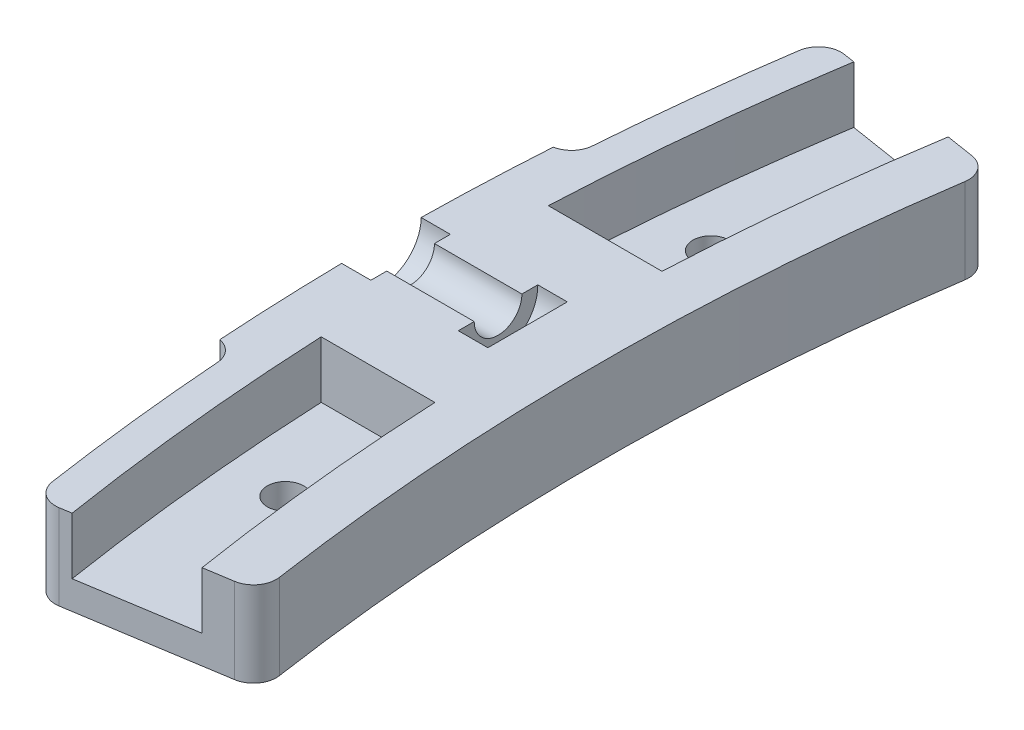
ISO-10303-21;
HEADER;
FILE_DESCRIPTION(('STEP AP214'),'2;1');
FILE_NAME('part.step','',(''),(''),'','','');
FILE_SCHEMA(('AUTOMOTIVE_DESIGN { 1 0 10303 214 1 1 1 1 }'));
ENDSEC;
DATA;
#1=APPLICATION_CONTEXT('core data for automotive mechanical design processes');
#2=APPLICATION_PROTOCOL_DEFINITION('international standard','automotive_design',2000,#1);
#3=PRODUCT_CONTEXT('',#1,'mechanical');
#4=PRODUCT('Part','Part','',(#3));
#5=PRODUCT_RELATED_PRODUCT_CATEGORY('part','',(#4));
#6=PRODUCT_DEFINITION_FORMATION('','',#4);
#7=PRODUCT_DEFINITION_CONTEXT('part definition',#1,'design');
#8=PRODUCT_DEFINITION('design','',#6,#7);
#9=PRODUCT_DEFINITION_SHAPE('','',#8);
#10=(LENGTH_UNIT() NAMED_UNIT(*) SI_UNIT(.MILLI.,.METRE.));
#11=(NAMED_UNIT(*) PLANE_ANGLE_UNIT() SI_UNIT($,.RADIAN.));
#12=(NAMED_UNIT(*) SI_UNIT($,.STERADIAN.) SOLID_ANGLE_UNIT());
#13=UNCERTAINTY_MEASURE_WITH_UNIT(LENGTH_MEASURE(1.E-05),#10,'distance_accuracy_value','');
#14=(GEOMETRIC_REPRESENTATION_CONTEXT(3) GLOBAL_UNCERTAINTY_ASSIGNED_CONTEXT((#13)) GLOBAL_UNIT_ASSIGNED_CONTEXT((#10,
#11,#12)) REPRESENTATION_CONTEXT('',''));
#15=CARTESIAN_POINT('',(0.,0.,0.));
#16=DIRECTION('',(0.,0.,1.));
#17=DIRECTION('',(1.,0.,0.));
#18=AXIS2_PLACEMENT_3D('',#15,#16,#17);
#19=CARTESIAN_POINT('',(0.,7.5,0.));
#20=DIRECTION('',(0.,1.,0.));
#21=DIRECTION('',(0.,0.,1.));
#22=AXIS2_PLACEMENT_3D('',#19,#20,#21);
#23=PLANE('',#22);
#24=CARTESIAN_POINT('',(0.,7.5,0.));
#25=DIRECTION('',(0.,1.,0.));
#26=DIRECTION('',(0.,0.,1.));
#27=AXIS2_PLACEMENT_3D('',#24,#25,#26);
#28=CIRCLE('',#27,224.5);
#29=CARTESIAN_POINT('',(-224.019328267066,7.5,-14.6830025121671));
#30=VERTEX_POINT('',#29);
#31=CARTESIAN_POINT('',(-224.472715491215,7.5,-3.5));
#32=VERTEX_POINT('',#31);
#33=EDGE_CURVE('E315',#30,#32,#28,.T.);
#34=ORIENTED_EDGE('',*,*,#33,.T.);
#35=DIRECTION('',(-1.,0.,0.));
#36=VECTOR('',#35,1.);
#37=CARTESIAN_POINT('',(-224.5,7.5,-3.5));
#38=LINE('',#37,#36);
#39=CARTESIAN_POINT('',(-221.9,7.5,-3.5));
#40=VERTEX_POINT('',#39);
#41=EDGE_CURVE('E220',#32,#40,#38,.F.);
#42=ORIENTED_EDGE('',*,*,#41,.T.);
#43=DIRECTION('',(0.,0.,1.));
#44=VECTOR('',#43,1.);
#45=CARTESIAN_POINT('',(-221.9,7.5,-3.21093044747705E-13));
#46=LINE('',#45,#44);
#47=CARTESIAN_POINT('',(-221.9,7.5,-2.10000000000001));
#48=VERTEX_POINT('',#47);
#49=EDGE_CURVE('E221',#40,#48,#46,.T.);
#50=ORIENTED_EDGE('',*,*,#49,.T.);
#51=DIRECTION('',(1.,0.,0.));
#52=VECTOR('',#51,1.);
#53=CARTESIAN_POINT('',(-224.5,7.5,-2.10000000000001));
#54=LINE('',#53,#52);
#55=CARTESIAN_POINT('',(-214.200000000001,7.5,-2.10000000000001));
#56=VERTEX_POINT('',#55);
#57=EDGE_CURVE('E242',#56,#48,#54,.F.);
#58=ORIENTED_EDGE('',*,*,#57,.F.);
#59=DIRECTION('',(0.,0.,1.));
#60=VECTOR('',#59,1.);
#61=CARTESIAN_POINT('',(-214.2,7.5,5.26399215997816E-12));
#62=LINE('',#61,#60);
#63=CARTESIAN_POINT('',(-214.200000000001,7.5,-3.49947186729268));
#64=VERTEX_POINT('',#63);
#65=EDGE_CURVE('E241',#64,#56,#62,.T.);
#66=ORIENTED_EDGE('',*,*,#65,.F.);
#67=DIRECTION('',(1.,0.,0.));
#68=VECTOR('',#67,1.);
#69=CARTESIAN_POINT('',(-214.200000000001,7.5,-3.49947186729268));
#70=LINE('',#69,#68);
#71=CARTESIAN_POINT('',(-211.600000000001,7.5,-3.49947186729274));
#72=VERTEX_POINT('',#71);
#73=EDGE_CURVE('E412',#64,#72,#70,.T.);
#74=ORIENTED_EDGE('',*,*,#73,.T.);
#75=DIRECTION('',(0.,0.,1.));
#76=VECTOR('',#75,1.);
#77=CARTESIAN_POINT('',(-211.6,7.5,5.20009683030522E-12));
#78=LINE('',#77,#76);
#79=CARTESIAN_POINT('',(-211.6,7.5,3.49947186730315));
#80=VERTEX_POINT('',#79);
#81=EDGE_CURVE('E404',#72,#80,#78,.T.);
#82=ORIENTED_EDGE('',*,*,#81,.T.);
#83=DIRECTION('',(1.,0.,0.));
#84=VECTOR('',#83,1.);
#85=CARTESIAN_POINT('',(-214.2,7.5,3.49947186730321));
#86=LINE('',#85,#84);
#87=CARTESIAN_POINT('',(-214.2,7.5,3.49947186730321));
#88=VERTEX_POINT('',#87);
#89=EDGE_CURVE('E409',#80,#88,#86,.F.);
#90=ORIENTED_EDGE('',*,*,#89,.T.);
#91=CARTESIAN_POINT('',(-214.2,7.5,2.09999999999999));
#92=VERTEX_POINT('',#91);
#93=EDGE_CURVE('E237',#92,#88,#62,.T.);
#94=ORIENTED_EDGE('',*,*,#93,.F.);
#95=DIRECTION('',(1.,0.,0.));
#96=VECTOR('',#95,1.);
#97=CARTESIAN_POINT('',(-224.5,7.5,2.09999999999999));
#98=LINE('',#97,#96);
#99=CARTESIAN_POINT('',(-221.9,7.5,2.09999999999999));
#100=VERTEX_POINT('',#99);
#101=EDGE_CURVE('E229',#100,#92,#98,.T.);
#102=ORIENTED_EDGE('',*,*,#101,.F.);
#103=CARTESIAN_POINT('',(-221.9,7.5,3.49999999999995));
#104=VERTEX_POINT('',#103);
#105=EDGE_CURVE('E56',#100,#104,#46,.T.);
#106=ORIENTED_EDGE('',*,*,#105,.T.);
#107=DIRECTION('',(-1.,0.,0.));
#108=VECTOR('',#107,1.);
#109=CARTESIAN_POINT('',(-224.5,7.5,3.49999999999995));
#110=LINE('',#109,#108);
#111=CARTESIAN_POINT('',(-224.472715491215,7.5,3.49999999999995));
#112=VERTEX_POINT('',#111);
#113=EDGE_CURVE('E214',#104,#112,#110,.T.);
#114=ORIENTED_EDGE('',*,*,#113,.T.);
#115=CARTESIAN_POINT('',(-224.019328267066,7.5,14.6830025121672));
#116=VERTEX_POINT('',#115);
#117=EDGE_CURVE('E318',#112,#116,#28,.T.);
#118=ORIENTED_EDGE('',*,*,#117,.T.);
#119=CARTESIAN_POINT('',(-224.383131319015,7.5,16.6496360162551));
#120=DIRECTION('',(0.,1.,0.));
#121=DIRECTION('',(0.,0.,1.));
#122=AXIS2_PLACEMENT_3D('',#119,#120,#121);
#123=CIRCLE('',#122,2.);
#124=CARTESIAN_POINT('',(-222.388614596179,7.5,16.5016392516661));
#125=VERTEX_POINT('',#124);
#126=EDGE_CURVE('E64',#116,#125,#123,.F.);
#127=ORIENTED_EDGE('',*,*,#126,.T.);
#128=CARTESIAN_POINT('',(0.,7.5,0.));
#129=DIRECTION('',(0.,1.,0.));
#130=DIRECTION('',(0.,0.,1.));
#131=AXIS2_PLACEMENT_3D('',#128,#129,#130);
#132=CIRCLE('',#131,223.);
#133=CARTESIAN_POINT('',(-220.561180845032,7.5,32.8902037732362));
#134=VERTEX_POINT('',#133);
#135=EDGE_CURVE('E336',#125,#134,#132,.T.);
#136=ORIENTED_EDGE('',*,*,#135,.T.);
#137=CARTESIAN_POINT('',(-218.583053662566,7.5,32.5952243671982));
#138=DIRECTION('',(0.,1.,0.));
#139=DIRECTION('',(0.,0.,1.));
#140=AXIS2_PLACEMENT_3D('',#137,#138,#139);
#141=CIRCLE('',#140,2.);
#142=CARTESIAN_POINT('',(-218.270184732485,7.5,34.5706010483885));
#143=VERTEX_POINT('',#142);
#144=EDGE_CURVE('E371',#134,#143,#141,.T.);
#145=ORIENTED_EDGE('',*,*,#144,.T.);
#146=DIRECTION('',(-0.987688340595137,0.,0.156434465040234));
#147=VECTOR('',#146,1.);
#148=CARTESIAN_POINT('',(0.,7.5,0.));
#149=LINE('',#148,#147);
#150=CARTESIAN_POINT('',(-217.29143493093,7.5,34.4155823088514));
#151=VERTEX_POINT('',#150);
#152=EDGE_CURVE('E330',#151,#143,#149,.T.);
#153=ORIENTED_EDGE('',*,*,#152,.F.);
#154=CARTESIAN_POINT('',(0.,7.5,0.));
#155=DIRECTION('',(0.,1.,0.));
#156=DIRECTION('',(0.,0.,1.));
#157=AXIS2_PLACEMENT_3D('',#154,#155,#156);
#158=CIRCLE('',#157,220.);
#159=CARTESIAN_POINT('',(-219.772609758359,7.5,10.));
#160=VERTEX_POINT('',#159);
#161=EDGE_CURVE('E302',#160,#151,#158,.T.);
#162=ORIENTED_EDGE('',*,*,#161,.F.);
#163=DIRECTION('',(-1.,0.,0.));
#164=VECTOR('',#163,1.);
#165=CARTESIAN_POINT('',(0.,7.5,10.));
#166=LINE('',#165,#164);
#167=CARTESIAN_POINT('',(-209.76176963403,7.5,10.));
#168=VERTEX_POINT('',#167);
#169=EDGE_CURVE('E300',#168,#160,#166,.T.);
#170=ORIENTED_EDGE('',*,*,#169,.F.);
#171=CARTESIAN_POINT('',(0.,7.5,0.));
#172=DIRECTION('',(0.,1.,0.));
#173=DIRECTION('',(0.,0.,1.));
#174=AXIS2_PLACEMENT_3D('',#171,#172,#173);
#175=CIRCLE('',#174,210.);
#176=CARTESIAN_POINT('',(-207.414551524979,7.5,32.8512376584491));
#177=VERTEX_POINT('',#176);
#178=EDGE_CURVE('E291',#168,#177,#175,.T.);
#179=ORIENTED_EDGE('',*,*,#178,.T.);
#180=CARTESIAN_POINT('',(-204.935810564757,7.5,32.4586436587549));
#181=VERTEX_POINT('',#180);
#182=EDGE_CURVE('E327',#181,#177,#149,.T.);
#183=ORIENTED_EDGE('',*,*,#182,.F.);
#184=CARTESIAN_POINT('',(-205.248679494837,7.5,30.4832669775646));
#185=DIRECTION('',(0.,1.,0.));
#186=DIRECTION('',(0.,0.,1.));
#187=AXIS2_PLACEMENT_3D('',#184,#185,#186);
#188=CIRCLE('',#187,2.);
#189=CARTESIAN_POINT('',(-203.270378969586,7.5,30.1894523560941));
#190=VERTEX_POINT('',#189);
#191=EDGE_CURVE('E373',#181,#190,#188,.T.);
#192=ORIENTED_EDGE('',*,*,#191,.T.);
#193=CARTESIAN_POINT('',(0.,7.5,0.));
#194=DIRECTION('',(0.,1.,0.));
#195=DIRECTION('',(0.,0.,1.));
#196=AXIS2_PLACEMENT_3D('',#193,#194,#195);
#197=CIRCLE('',#196,205.5);
#198=CARTESIAN_POINT('',(-203.270378969586,7.5,-30.1894523560941));
#199=VERTEX_POINT('',#198);
#200=EDGE_CURVE('E329',#199,#190,#197,.T.);
#201=ORIENTED_EDGE('',*,*,#200,.F.);
#202=CARTESIAN_POINT('',(-205.248679494837,7.5,-30.4832669775646));
#203=DIRECTION('',(0.,1.,0.));
#204=DIRECTION('',(0.,0.,1.));
#205=AXIS2_PLACEMENT_3D('',#202,#203,#204);
#206=CIRCLE('',#205,2.);
#207=CARTESIAN_POINT('',(-204.935810564757,7.5,-32.4586436587549));
#208=VERTEX_POINT('',#207);
#209=EDGE_CURVE('E375',#199,#208,#206,.T.);
#210=ORIENTED_EDGE('',*,*,#209,.T.);
#211=DIRECTION('',(0.987688340595137,0.,0.156434465040234));
#212=VECTOR('',#211,1.);
#213=CARTESIAN_POINT('',(0.,7.5,0.));
#214=LINE('',#213,#212);
#215=CARTESIAN_POINT('',(-207.414551524979,7.5,-32.8512376584492));
#216=VERTEX_POINT('',#215);
#217=EDGE_CURVE('E333',#216,#208,#214,.T.);
#218=ORIENTED_EDGE('',*,*,#217,.F.);
#219=CARTESIAN_POINT('',(0.,7.5,0.));
#220=DIRECTION('',(0.,1.,0.));
#221=DIRECTION('',(0.,0.,1.));
#222=AXIS2_PLACEMENT_3D('',#219,#220,#221);
#223=CIRCLE('',#222,210.);
#224=CARTESIAN_POINT('',(-209.76176963403,7.5,-9.99999999999998));
#225=VERTEX_POINT('',#224);
#226=EDGE_CURVE('E260',#216,#225,#223,.T.);
#227=ORIENTED_EDGE('',*,*,#226,.T.);
#228=DIRECTION('',(-1.,0.,0.));
#229=VECTOR('',#228,1.);
#230=CARTESIAN_POINT('',(0.,7.5,-10.));
#231=LINE('',#230,#229);
#232=CARTESIAN_POINT('',(-219.772609758359,7.5,-9.99999999999997));
#233=VERTEX_POINT('',#232);
#234=EDGE_CURVE('E271',#225,#233,#231,.T.);
#235=ORIENTED_EDGE('',*,*,#234,.T.);
#236=CARTESIAN_POINT('',(0.,7.5,0.));
#237=DIRECTION('',(0.,1.,0.));
#238=DIRECTION('',(0.,0.,1.));
#239=AXIS2_PLACEMENT_3D('',#236,#237,#238);
#240=CIRCLE('',#239,220.);
#241=CARTESIAN_POINT('',(-217.29143493093,7.5,-34.4155823088514));
#242=VERTEX_POINT('',#241);
#243=EDGE_CURVE('E268',#242,#233,#240,.T.);
#244=ORIENTED_EDGE('',*,*,#243,.F.);
#245=CARTESIAN_POINT('',(-218.270184732485,7.5,-34.5706010483885));
#246=VERTEX_POINT('',#245);
#247=EDGE_CURVE('E334',#246,#242,#214,.T.);
#248=ORIENTED_EDGE('',*,*,#247,.F.);
#249=CARTESIAN_POINT('',(-218.583053662566,7.5,-32.5952243671982));
#250=DIRECTION('',(0.,1.,0.));
#251=DIRECTION('',(0.,0.,1.));
#252=AXIS2_PLACEMENT_3D('',#249,#250,#251);
#253=CIRCLE('',#252,2.);
#254=CARTESIAN_POINT('',(-220.561180845032,7.5,-32.8902037732362));
#255=VERTEX_POINT('',#254);
#256=EDGE_CURVE('E377',#246,#255,#253,.T.);
#257=ORIENTED_EDGE('',*,*,#256,.T.);
#258=CARTESIAN_POINT('',(-222.388614596179,7.5,-16.5016392516641));
#259=VERTEX_POINT('',#258);
#260=EDGE_CURVE('E337',#255,#259,#132,.T.);
#261=ORIENTED_EDGE('',*,*,#260,.T.);
#262=CARTESIAN_POINT('',(-224.383131319015,7.5,-16.649636016253));
#263=DIRECTION('',(0.,1.,0.));
#264=DIRECTION('',(0.,0.,1.));
#265=AXIS2_PLACEMENT_3D('',#262,#263,#264);
#266=CIRCLE('',#265,2.);
#267=EDGE_CURVE('E399',#259,#30,#266,.F.);
#268=ORIENTED_EDGE('',*,*,#267,.T.);
#269=EDGE_LOOP('',(#34,#42,#50,#58,#66,#74,#82,#90,#94,#102,#106,#114,#118,#127,#136,#145,#153,
#162,#170,#179,#183,#192,#201,#210,#218,#227,#235,#244,#248,#257,#261,#268));
#270=FACE_BOUND('',#269,.T.);
#271=ADVANCED_FACE('F35',(#270),#23,.T.);
#272=CARTESIAN_POINT('',(0.,7.5,0.));
#273=DIRECTION('',(0.,-1.,0.));
#274=DIRECTION('',(0.,0.,-1.));
#275=AXIS2_PLACEMENT_3D('',#272,#273,#274);
#276=CYLINDRICAL_SURFACE('',#275,224.5);
#277=CARTESIAN_POINT('',(-224.472715491215,7.5,-3.5));
#278=CARTESIAN_POINT('',(-224.472714861712,7.40156578840338,-3.50000943737716));
#279=CARTESIAN_POINT('',(-224.472780225117,7.30313605810773,-3.49584747938354));
#280=CARTESIAN_POINT('',(-224.473038289765,7.1069809173122,-3.47925381156051));
#281=CARTESIAN_POINT('',(-224.473230984854,7.00925547300403,-3.46682250139931));
#282=CARTESIAN_POINT('',(-224.473738885951,6.8152632798036,-3.43377485265587));
#283=CARTESIAN_POINT('',(-224.474054005164,6.71899554756869,-3.41316431264958));
#284=CARTESIAN_POINT('',(-224.474797261434,6.52856227230528,-3.36392550562658));
#285=CARTESIAN_POINT('',(-224.475225397129,6.43439670394645,-3.33529733527587));
#286=CARTESIAN_POINT('',(-224.476662783917,6.15596524404037,-3.23761897666636));
#287=CARTESIAN_POINT('',(-224.477825245954,5.97568200368354,-3.15676079513716));
#288=CARTESIAN_POINT('',(-224.480426703749,5.63138518923722,-2.96598425473683));
#289=CARTESIAN_POINT('',(-224.48186564567,5.46736845712206,-2.85607155183975));
#290=CARTESIAN_POINT('',(-224.484858395544,5.16006978767687,-2.61025296217331));
#291=CARTESIAN_POINT('',(-224.486412214712,5.01678987859334,-2.47434453580414));
#292=CARTESIAN_POINT('',(-224.489459632982,4.7550649998637,-2.18038409126837));
#293=CARTESIAN_POINT('',(-224.490953222877,4.63662381547567,-2.02232870416418));
#294=CARTESIAN_POINT('',(-224.493711562528,4.42795602564902,-1.68857247177381));
#295=CARTESIAN_POINT('',(-224.494976310728,4.33772961211474,-1.51287150648099));
#296=CARTESIAN_POINT('',(-224.497134279755,4.18806213664848,-1.14882485480166));
#297=CARTESIAN_POINT('',(-224.498027524533,4.12861909003653,-0.960479984483708));
#298=CARTESIAN_POINT('',(-224.499341856259,4.04220007556948,-0.576494033295446));
#299=CARTESIAN_POINT('',(-224.499762972449,4.01522209692809,-0.380853405075799));
#300=CARTESIAN_POINT('',(-224.500085673098,3.99449295010015,0.0121851581695328));
#301=CARTESIAN_POINT('',(-224.499987245918,4.00074252625487,0.209583132463208));
#302=CARTESIAN_POINT('',(-224.499281965034,4.04629033944203,0.600508238712189));
#303=CARTESIAN_POINT('',(-224.498675160583,4.08558537482803,0.794035743802672));
#304=CARTESIAN_POINT('',(-224.497021592075,4.1961036468751,1.17174593250207));
#305=CARTESIAN_POINT('',(-224.495974829285,4.26732679152409,1.35592864303959));
#306=CARTESIAN_POINT('',(-224.493559239443,4.43968478895614,1.70973551861152));
#307=CARTESIAN_POINT('',(-224.492190389736,4.54082174598735,1.87935865838854));
#308=CARTESIAN_POINT('',(-224.489285031404,4.77012988756459,2.19921078253235));
#309=CARTESIAN_POINT('',(-224.487748530898,4.89829976292092,2.34944070553442));
#310=CARTESIAN_POINT('',(-224.484681028317,5.17803246732865,2.62624976845429));
#311=CARTESIAN_POINT('',(-224.483150026089,5.32959464646475,2.75282956523463));
#312=CARTESIAN_POINT('',(-224.480265583076,5.65187883091553,2.97878840736272));
#313=CARTESIAN_POINT('',(-224.478912198826,5.82260690456416,3.07815880318588));
#314=CARTESIAN_POINT('',(-224.476535449462,6.17839774925335,3.24687297259607));
#315=CARTESIAN_POINT('',(-224.475512286169,6.36346920112557,3.31619839255343));
#316=CARTESIAN_POINT('',(-224.473914065314,6.74248187923012,3.4226871967959));
#317=CARTESIAN_POINT('',(-224.473338323597,6.93640908134263,3.45989969487162));
#318=CARTESIAN_POINT('',(-224.472916934368,7.19302192271803,3.48705818759328));
#319=CARTESIAN_POINT('',(-224.472841431698,7.25437105769747,3.49191392810576));
#320=CARTESIAN_POINT('',(-224.472740777511,7.37713851009347,3.49838040408815));
#321=CARTESIAN_POINT('',(-224.472715542936,7.4385565453343,3.49999649249394));
#322=CARTESIAN_POINT('',(-224.472715491215,7.5,3.49999999999995));
#323=B_SPLINE_CURVE_WITH_KNOTS('',3,(#277,#278,#279,#280,#281,#282,#283,#284,#285,#286,#287,
#288,#289,#290,#291,#292,#293,#294,#295,#296,#297,#298,#299,#300,#301,#302,#303,#304,#305,#306,
#307,#308,#309,#310,#311,#312,#313,#314,#315,#316,#317,#318,#319,#320,#321,#322),.UNSPECIFIED.,
.F.,.F.,(4,2,2,2,2,2,2,2,2,2,2,2,2,2,2,2,2,2,2,2,2,2,4),(0.,0.295206576251059,0.590398885833,
0.885382294826047,1.18036214745175,1.77007362886811,2.35967039699536,2.94932479403663,
3.53906898533124,4.12881718771663,4.71852736283831,5.30820101124837,5.89788786918531,
6.48751760122972,7.07714563405961,7.6668151533735,8.25645612186404,8.84608071113289,
9.43589251757688,10.0260641173299,10.6153314954947,10.7998949857025,10.9841532661159),.UNSPECIFIED.);
#324=EDGE_CURVE('E11',#32,#112,#323,.T.);
#325=ORIENTED_EDGE('',*,*,#324,.F.);
#326=ORIENTED_EDGE('',*,*,#33,.F.);
#327=DIRECTION('',(0.,-1.,0.));
#328=VECTOR('',#327,1.);
#329=CARTESIAN_POINT('',(-224.019328267066,7.5,-14.6830025121671));
#330=LINE('',#329,#328);
#331=CARTESIAN_POINT('',(-224.019328267066,0.,-14.6830025121671));
#332=VERTEX_POINT('',#331);
#333=EDGE_CURVE('E317',#30,#332,#330,.T.);
#334=ORIENTED_EDGE('',*,*,#333,.T.);
#335=CARTESIAN_POINT('',(0.,0.,0.));
#336=DIRECTION('',(0.,1.,0.));
#337=DIRECTION('',(0.,0.,1.));
#338=AXIS2_PLACEMENT_3D('',#335,#336,#337);
#339=CIRCLE('',#338,224.5);
#340=CARTESIAN_POINT('',(-224.019328267066,0.,14.6830025121672));
#341=VERTEX_POINT('',#340);
#342=EDGE_CURVE('E280',#332,#341,#339,.T.);
#343=ORIENTED_EDGE('',*,*,#342,.T.);
#344=DIRECTION('',(0.,-1.,0.));
#345=VECTOR('',#344,1.);
#346=CARTESIAN_POINT('',(-224.019328267066,7.5,14.6830025121672));
#347=LINE('',#346,#345);
#348=EDGE_CURVE('E323',#116,#341,#347,.T.);
#349=ORIENTED_EDGE('',*,*,#348,.F.);
#350=ORIENTED_EDGE('',*,*,#117,.F.);
#351=EDGE_LOOP('',(#325,#326,#334,#343,#349,#350));
#352=FACE_BOUND('',#351,.T.);
#353=ADVANCED_FACE('F439',(#352),#276,.T.);
#354=CARTESIAN_POINT('',(-224.5,7.5,0.));
#355=DIRECTION('',(1.,0.,0.));
#356=DIRECTION('',(0.,0.,-1.));
#357=AXIS2_PLACEMENT_3D('',#354,#355,#356);
#358=CYLINDRICAL_SURFACE('',#357,2.1);
#359=CARTESIAN_POINT('',(-221.9,7.5,0.));
#360=DIRECTION('',(-1.,0.,0.));
#361=DIRECTION('',(0.,0.,1.));
#362=AXIS2_PLACEMENT_3D('',#359,#360,#361);
#363=CIRCLE('',#362,2.1);
#364=EDGE_CURVE('E49',#100,#48,#363,.F.);
#365=ORIENTED_EDGE('',*,*,#364,.F.);
#366=ORIENTED_EDGE('',*,*,#101,.T.);
#367=CARTESIAN_POINT('',(-214.2,7.5,0.));
#368=DIRECTION('',(-1.,0.,0.));
#369=DIRECTION('',(0.,0.,1.));
#370=AXIS2_PLACEMENT_3D('',#367,#368,#369);
#371=CIRCLE('',#370,2.1);
#372=EDGE_CURVE('E406',#92,#56,#371,.F.);
#373=ORIENTED_EDGE('',*,*,#372,.T.);
#374=ORIENTED_EDGE('',*,*,#57,.T.);
#375=EDGE_LOOP('',(#365,#366,#373,#374));
#376=FACE_BOUND('',#375,.T.);
#377=ADVANCED_FACE('F417',(#376),#358,.F.);
#378=CARTESIAN_POINT('',(0.,7.5,0.));
#379=DIRECTION('',(0.156434465040234,0.,0.987688340595137));
#380=DIRECTION('',(0.987688340595137,0.,-0.156434465040234));
#381=AXIS2_PLACEMENT_3D('',#378,#379,#380);
#382=PLANE('',#381);
#383=DIRECTION('',(-0.987688340595137,0.,0.156434465040234));
#384=VECTOR('',#383,1.);
#385=CARTESIAN_POINT('',(0.,0.,0.));
#386=LINE('',#385,#384);
#387=CARTESIAN_POINT('',(-204.935810564757,0.,32.4586436587549));
#388=VERTEX_POINT('',#387);
#389=CARTESIAN_POINT('',(-218.270184732485,0.,34.5706010483885));
#390=VERTEX_POINT('',#389);
#391=EDGE_CURVE('E326',#388,#390,#386,.T.);
#392=ORIENTED_EDGE('',*,*,#391,.F.);
#393=DIRECTION('',(0.,-1.,0.));
#394=VECTOR('',#393,1.);
#395=CARTESIAN_POINT('',(-204.935810564757,7.5,32.4586436587549));
#396=LINE('',#395,#394);
#397=EDGE_CURVE('E387',#388,#181,#396,.F.);
#398=ORIENTED_EDGE('',*,*,#397,.T.);
#399=ORIENTED_EDGE('',*,*,#182,.T.);
#400=DIRECTION('',(0.,1.,0.));
#401=VECTOR('',#400,1.);
#402=CARTESIAN_POINT('',(-207.414551524979,2.5,32.8512376584491));
#403=LINE('',#402,#401);
#404=CARTESIAN_POINT('',(-207.414551524979,2.5,32.8512376584491));
#405=VERTEX_POINT('',#404);
#406=EDGE_CURVE('E307',#405,#177,#403,.T.);
#407=ORIENTED_EDGE('',*,*,#406,.F.);
#408=DIRECTION('',(0.987688340595137,0.,-0.156434465040234));
#409=VECTOR('',#408,1.);
#410=CARTESIAN_POINT('',(0.,2.5,0.));
#411=LINE('',#410,#409);
#412=CARTESIAN_POINT('',(-217.29143493093,2.5,34.4155823088514));
#413=VERTEX_POINT('',#412);
#414=EDGE_CURVE('E294',#413,#405,#411,.T.);
#415=ORIENTED_EDGE('',*,*,#414,.F.);
#416=DIRECTION('',(0.,1.,0.));
#417=VECTOR('',#416,1.);
#418=CARTESIAN_POINT('',(-217.29143493093,2.5,34.4155823088514));
#419=LINE('',#418,#417);
#420=EDGE_CURVE('E310',#413,#151,#419,.T.);
#421=ORIENTED_EDGE('',*,*,#420,.T.);
#422=ORIENTED_EDGE('',*,*,#152,.T.);
#423=DIRECTION('',(0.,1.,0.));
#424=VECTOR('',#423,1.);
#425=CARTESIAN_POINT('',(-218.270184732485,0.,34.5706010483885));
#426=LINE('',#425,#424);
#427=EDGE_CURVE('E384',#143,#390,#426,.F.);
#428=ORIENTED_EDGE('',*,*,#427,.T.);
#429=EDGE_LOOP('',(#392,#398,#399,#407,#415,#421,#422,#428));
#430=FACE_BOUND('',#429,.T.);
#431=ADVANCED_FACE('F462',(#430),#382,.T.);
#432=CARTESIAN_POINT('',(0.,7.5,0.));
#433=DIRECTION('',(0.156434465040234,0.,-0.987688340595137));
#434=DIRECTION('',(-0.987688340595137,0.,-0.156434465040234));
#435=AXIS2_PLACEMENT_3D('',#432,#433,#434);
#436=PLANE('',#435);
#437=DIRECTION('',(0.987688340595137,0.,0.156434465040234));
#438=VECTOR('',#437,1.);
#439=CARTESIAN_POINT('',(0.,0.,0.));
#440=LINE('',#439,#438);
#441=CARTESIAN_POINT('',(-218.270184732485,0.,-34.5706010483885));
#442=VERTEX_POINT('',#441);
#443=CARTESIAN_POINT('',(-204.935810564757,0.,-32.4586436587549));
#444=VERTEX_POINT('',#443);
#445=EDGE_CURVE('E346',#442,#444,#440,.T.);
#446=ORIENTED_EDGE('',*,*,#445,.F.);
#447=DIRECTION('',(0.,1.,0.));
#448=VECTOR('',#447,1.);
#449=CARTESIAN_POINT('',(-218.270184732485,7.5,-34.5706010483885));
#450=LINE('',#449,#448);
#451=EDGE_CURVE('E369',#442,#246,#450,.T.);
#452=ORIENTED_EDGE('',*,*,#451,.T.);
#453=ORIENTED_EDGE('',*,*,#247,.T.);
#454=DIRECTION('',(0.,1.,0.));
#455=VECTOR('',#454,1.);
#456=CARTESIAN_POINT('',(-217.291434930931,2.5,-34.4155823088515));
#457=LINE('',#456,#455);
#458=CARTESIAN_POINT('',(-217.291434930931,2.5,-34.4155823088515));
#459=VERTEX_POINT('',#458);
#460=EDGE_CURVE('E267',#459,#242,#457,.T.);
#461=ORIENTED_EDGE('',*,*,#460,.F.);
#462=DIRECTION('',(-0.987688340595137,0.,-0.156434465040234));
#463=VECTOR('',#462,1.);
#464=CARTESIAN_POINT('',(0.,2.5,0.));
#465=LINE('',#464,#463);
#466=CARTESIAN_POINT('',(-207.414551524979,2.5,-32.8512376584492));
#467=VERTEX_POINT('',#466);
#468=EDGE_CURVE('E256',#467,#459,#465,.T.);
#469=ORIENTED_EDGE('',*,*,#468,.F.);
#470=DIRECTION('',(0.,1.,0.));
#471=VECTOR('',#470,1.);
#472=CARTESIAN_POINT('',(-207.414551524979,2.5,-32.8512376584492));
#473=LINE('',#472,#471);
#474=EDGE_CURVE('E277',#467,#216,#473,.T.);
#475=ORIENTED_EDGE('',*,*,#474,.T.);
#476=ORIENTED_EDGE('',*,*,#217,.T.);
#477=DIRECTION('',(0.,-1.,0.));
#478=VECTOR('',#477,1.);
#479=CARTESIAN_POINT('',(-204.935810564757,7.5,-32.4586436587549));
#480=LINE('',#479,#478);
#481=EDGE_CURVE('E366',#208,#444,#480,.T.);
#482=ORIENTED_EDGE('',*,*,#481,.T.);
#483=EDGE_LOOP('',(#446,#452,#453,#461,#469,#475,#476,#482));
#484=FACE_BOUND('',#483,.T.);
#485=ADVANCED_FACE('F458',(#484),#436,.T.);
#486=CARTESIAN_POINT('',(0.,7.5,0.));
#487=DIRECTION('',(0.,-1.,0.));
#488=DIRECTION('',(0.,0.,-1.));
#489=AXIS2_PLACEMENT_3D('',#486,#487,#488);
#490=CYLINDRICAL_SURFACE('',#489,223.);
#491=ORIENTED_EDGE('',*,*,#135,.F.);
#492=DIRECTION('',(0.,-1.,0.));
#493=VECTOR('',#492,1.);
#494=CARTESIAN_POINT('',(-222.388614596179,7.5,16.5016392516661));
#495=LINE('',#494,#493);
#496=CARTESIAN_POINT('',(-222.388614596179,0.,16.5016392516661));
#497=VERTEX_POINT('',#496);
#498=EDGE_CURVE('E394',#125,#497,#495,.T.);
#499=ORIENTED_EDGE('',*,*,#498,.T.);
#500=CARTESIAN_POINT('',(0.,0.,0.));
#501=DIRECTION('',(0.,1.,0.));
#502=DIRECTION('',(0.,0.,1.));
#503=AXIS2_PLACEMENT_3D('',#500,#501,#502);
#504=CIRCLE('',#503,223.);
#505=CARTESIAN_POINT('',(-220.561180845032,0.,32.8902037732362));
#506=VERTEX_POINT('',#505);
#507=EDGE_CURVE('E349',#497,#506,#504,.T.);
#508=ORIENTED_EDGE('',*,*,#507,.T.);
#509=DIRECTION('',(0.,-1.,0.));
#510=VECTOR('',#509,1.);
#511=CARTESIAN_POINT('',(-220.561180845032,7.5,32.8902037732362));
#512=LINE('',#511,#510);
#513=EDGE_CURVE('E389',#506,#134,#512,.F.);
#514=ORIENTED_EDGE('',*,*,#513,.T.);
#515=EDGE_LOOP('',(#491,#499,#508,#514));
#516=FACE_BOUND('',#515,.T.);
#517=ADVANCED_FACE('F454',(#516),#490,.T.);
#518=CARTESIAN_POINT('',(-220.561180845032,0.,-32.8902037732362));
#519=VERTEX_POINT('',#518);
#520=CARTESIAN_POINT('',(-222.388614596179,0.,-16.5016392516641));
#521=VERTEX_POINT('',#520);
#522=EDGE_CURVE('E350',#519,#521,#504,.T.);
#523=ORIENTED_EDGE('',*,*,#522,.T.);
#524=DIRECTION('',(0.,-1.,0.));
#525=VECTOR('',#524,1.);
#526=CARTESIAN_POINT('',(-222.388614596179,7.5,-16.5016392516641));
#527=LINE('',#526,#525);
#528=EDGE_CURVE('E392',#521,#259,#527,.F.);
#529=ORIENTED_EDGE('',*,*,#528,.T.);
#530=ORIENTED_EDGE('',*,*,#260,.F.);
#531=DIRECTION('',(0.,-1.,0.));
#532=VECTOR('',#531,1.);
#533=CARTESIAN_POINT('',(-220.561180845032,7.5,-32.8902037732362));
#534=LINE('',#533,#532);
#535=EDGE_CURVE('E340',#255,#519,#534,.T.);
#536=ORIENTED_EDGE('',*,*,#535,.T.);
#537=EDGE_LOOP('',(#523,#529,#530,#536));
#538=FACE_BOUND('',#537,.T.);
#539=ADVANCED_FACE('F457',(#538),#490,.T.);
#540=CARTESIAN_POINT('',(0.,7.5,0.));
#541=DIRECTION('',(0.,-1.,0.));
#542=DIRECTION('',(0.,0.,-1.));
#543=AXIS2_PLACEMENT_3D('',#540,#541,#542);
#544=CYLINDRICAL_SURFACE('',#543,205.5);
#545=CARTESIAN_POINT('',(0.,0.,0.));
#546=DIRECTION('',(0.,1.,0.));
#547=DIRECTION('',(0.,0.,1.));
#548=AXIS2_PLACEMENT_3D('',#545,#546,#547);
#549=CIRCLE('',#548,205.5);
#550=CARTESIAN_POINT('',(-203.270378969586,0.,-30.1894523560941));
#551=VERTEX_POINT('',#550);
#552=CARTESIAN_POINT('',(-203.270378969586,0.,30.1894523560941));
#553=VERTEX_POINT('',#552);
#554=EDGE_CURVE('E343',#551,#553,#549,.T.);
#555=ORIENTED_EDGE('',*,*,#554,.F.);
#556=DIRECTION('',(0.,-1.,0.));
#557=VECTOR('',#556,1.);
#558=CARTESIAN_POINT('',(-203.270378969586,7.5,-30.1894523560941));
#559=LINE('',#558,#557);
#560=EDGE_CURVE('E382',#551,#199,#559,.F.);
#561=ORIENTED_EDGE('',*,*,#560,.T.);
#562=ORIENTED_EDGE('',*,*,#200,.T.);
#563=DIRECTION('',(0.,-1.,0.));
#564=VECTOR('',#563,1.);
#565=CARTESIAN_POINT('',(-203.270378969586,7.5,30.1894523560941));
#566=LINE('',#565,#564);
#567=EDGE_CURVE('E379',#190,#553,#566,.T.);
#568=ORIENTED_EDGE('',*,*,#567,.T.);
#569=EDGE_LOOP('',(#555,#561,#562,#568));
#570=FACE_BOUND('',#569,.T.);
#571=ADVANCED_FACE('F452',(#570),#544,.F.);
#572=CARTESIAN_POINT('',(0.,0.,0.));
#573=DIRECTION('',(0.,1.,0.));
#574=DIRECTION('',(0.,0.,1.));
#575=AXIS2_PLACEMENT_3D('',#572,#573,#574);
#576=PLANE('',#575);
#577=CARTESIAN_POINT('',(-214.181860089725,0.,18.7384846907466));
#578=DIRECTION('',(0.,-1.,0.));
#579=DIRECTION('',(0.,0.,-1.));
#580=AXIS2_PLACEMENT_3D('',#577,#578,#579);
#581=CIRCLE('',#580,1.59999999999999);
#582=CARTESIAN_POINT('',(-214.181860089725,0.,17.1384846907466));
#583=VERTEX_POINT('',#582);
#584=EDGE_CURVE('E246',#583,#583,#581,.T.);
#585=ORIENTED_EDGE('',*,*,#584,.F.);
#586=EDGE_LOOP('',(#585));
#587=FACE_BOUND('',#586,.T.);
#588=CARTESIAN_POINT('',(-214.181860089725,0.,-18.7384846907465));
#589=DIRECTION('',(0.,-1.,0.));
#590=DIRECTION('',(0.,0.,-1.));
#591=AXIS2_PLACEMENT_3D('',#588,#589,#590);
#592=CIRCLE('',#591,1.59999999999999);
#593=CARTESIAN_POINT('',(-214.181860089725,0.,-20.3384846907465));
#594=VERTEX_POINT('',#593);
#595=EDGE_CURVE('E252',#594,#594,#592,.T.);
#596=ORIENTED_EDGE('',*,*,#595,.F.);
#597=EDGE_LOOP('',(#596));
#598=FACE_BOUND('',#597,.T.);
#599=ORIENTED_EDGE('',*,*,#522,.F.);
#600=CARTESIAN_POINT('',(-218.583053662566,0.,-32.5952243671982));
#601=DIRECTION('',(0.,1.,0.));
#602=DIRECTION('',(0.,0.,1.));
#603=AXIS2_PLACEMENT_3D('',#600,#601,#602);
#604=CIRCLE('',#603,2.);
#605=EDGE_CURVE('E364',#519,#442,#604,.F.);
#606=ORIENTED_EDGE('',*,*,#605,.T.);
#607=ORIENTED_EDGE('',*,*,#445,.T.);
#608=CARTESIAN_POINT('',(-205.248679494837,0.,-30.4832669775646));
#609=DIRECTION('',(0.,1.,0.));
#610=DIRECTION('',(0.,0.,1.));
#611=AXIS2_PLACEMENT_3D('',#608,#609,#610);
#612=CIRCLE('',#611,2.);
#613=EDGE_CURVE('E362',#444,#551,#612,.F.);
#614=ORIENTED_EDGE('',*,*,#613,.T.);
#615=ORIENTED_EDGE('',*,*,#554,.T.);
#616=CARTESIAN_POINT('',(-205.248679494837,0.,30.4832669775646));
#617=DIRECTION('',(0.,1.,0.));
#618=DIRECTION('',(0.,0.,1.));
#619=AXIS2_PLACEMENT_3D('',#616,#617,#618);
#620=CIRCLE('',#619,2.);
#621=EDGE_CURVE('E360',#553,#388,#620,.F.);
#622=ORIENTED_EDGE('',*,*,#621,.T.);
#623=ORIENTED_EDGE('',*,*,#391,.T.);
#624=CARTESIAN_POINT('',(-218.583053662566,0.,32.5952243671982));
#625=DIRECTION('',(0.,1.,0.));
#626=DIRECTION('',(0.,0.,1.));
#627=AXIS2_PLACEMENT_3D('',#624,#625,#626);
#628=CIRCLE('',#627,2.);
#629=EDGE_CURVE('E357',#390,#506,#628,.F.);
#630=ORIENTED_EDGE('',*,*,#629,.T.);
#631=ORIENTED_EDGE('',*,*,#507,.F.);
#632=CARTESIAN_POINT('',(-224.383131319015,0.,16.6496360162551));
#633=DIRECTION('',(0.,1.,0.));
#634=DIRECTION('',(0.,0.,1.));
#635=AXIS2_PLACEMENT_3D('',#632,#633,#634);
#636=CIRCLE('',#635,2.);
#637=EDGE_CURVE('E401',#497,#341,#636,.T.);
#638=ORIENTED_EDGE('',*,*,#637,.T.);
#639=ORIENTED_EDGE('',*,*,#342,.F.);
#640=CARTESIAN_POINT('',(-224.383131319015,0.,-16.649636016253));
#641=DIRECTION('',(0.,1.,0.));
#642=DIRECTION('',(0.,0.,1.));
#643=AXIS2_PLACEMENT_3D('',#640,#641,#642);
#644=CIRCLE('',#643,2.);
#645=EDGE_CURVE('E397',#332,#521,#644,.T.);
#646=ORIENTED_EDGE('',*,*,#645,.T.);
#647=EDGE_LOOP('',(#599,#606,#607,#614,#615,#622,#623,#630,#631,#638,#639,#646));
#648=FACE_BOUND('',#647,.T.);
#649=ADVANCED_FACE('F448',(#587,#598,#648),#576,.F.);
#650=CARTESIAN_POINT('',(0.,2.5,10.));
#651=DIRECTION('',(0.,0.,-1.));
#652=DIRECTION('',(-1.,0.,0.));
#653=AXIS2_PLACEMENT_3D('',#650,#651,#652);
#654=PLANE('',#653);
#655=ORIENTED_EDGE('',*,*,#169,.T.);
#656=DIRECTION('',(0.,1.,0.));
#657=VECTOR('',#656,1.);
#658=CARTESIAN_POINT('',(-219.772609758359,2.5,10.));
#659=LINE('',#658,#657);
#660=CARTESIAN_POINT('',(-219.772609758359,2.5,10.));
#661=VERTEX_POINT('',#660);
#662=EDGE_CURVE('E299',#661,#160,#659,.T.);
#663=ORIENTED_EDGE('',*,*,#662,.F.);
#664=DIRECTION('',(-1.,0.,0.));
#665=VECTOR('',#664,1.);
#666=CARTESIAN_POINT('',(0.,2.5,10.));
#667=LINE('',#666,#665);
#668=CARTESIAN_POINT('',(-209.76176963403,2.5,10.));
#669=VERTEX_POINT('',#668);
#670=EDGE_CURVE('E287',#669,#661,#667,.T.);
#671=ORIENTED_EDGE('',*,*,#670,.F.);
#672=DIRECTION('',(0.,1.,0.));
#673=VECTOR('',#672,1.);
#674=CARTESIAN_POINT('',(-209.76176963403,2.5,10.));
#675=LINE('',#674,#673);
#676=EDGE_CURVE('E272',#669,#168,#675,.T.);
#677=ORIENTED_EDGE('',*,*,#676,.T.);
#678=EDGE_LOOP('',(#655,#663,#671,#677));
#679=FACE_BOUND('',#678,.T.);
#680=ADVANCED_FACE('F451',(#679),#654,.F.);
#681=CARTESIAN_POINT('',(0.,2.5,0.));
#682=DIRECTION('',(0.,1.,0.));
#683=DIRECTION('',(0.,0.,1.));
#684=AXIS2_PLACEMENT_3D('',#681,#682,#683);
#685=CYLINDRICAL_SURFACE('',#684,210.);
#686=ORIENTED_EDGE('',*,*,#178,.F.);
#687=ORIENTED_EDGE('',*,*,#676,.F.);
#688=CARTESIAN_POINT('',(0.,2.5,0.));
#689=DIRECTION('',(0.,1.,0.));
#690=DIRECTION('',(0.,0.,1.));
#691=AXIS2_PLACEMENT_3D('',#688,#689,#690);
#692=CIRCLE('',#691,210.);
#693=EDGE_CURVE('E297',#669,#405,#692,.T.);
#694=ORIENTED_EDGE('',*,*,#693,.T.);
#695=ORIENTED_EDGE('',*,*,#406,.T.);
#696=EDGE_LOOP('',(#686,#687,#694,#695));
#697=FACE_BOUND('',#696,.T.);
#698=ADVANCED_FACE('F523',(#697),#685,.T.);
#699=CARTESIAN_POINT('',(0.,2.5,0.));
#700=DIRECTION('',(0.,1.,0.));
#701=DIRECTION('',(0.,0.,1.));
#702=AXIS2_PLACEMENT_3D('',#699,#700,#701);
#703=CYLINDRICAL_SURFACE('',#702,220.);
#704=ORIENTED_EDGE('',*,*,#161,.T.);
#705=ORIENTED_EDGE('',*,*,#420,.F.);
#706=CARTESIAN_POINT('',(0.,2.5,0.));
#707=DIRECTION('',(0.,1.,0.));
#708=DIRECTION('',(0.,0.,1.));
#709=AXIS2_PLACEMENT_3D('',#706,#707,#708);
#710=CIRCLE('',#709,220.);
#711=EDGE_CURVE('E290',#661,#413,#710,.T.);
#712=ORIENTED_EDGE('',*,*,#711,.F.);
#713=ORIENTED_EDGE('',*,*,#662,.T.);
#714=EDGE_LOOP('',(#704,#705,#712,#713));
#715=FACE_BOUND('',#714,.T.);
#716=ADVANCED_FACE('F512',(#715),#703,.F.);
#717=CARTESIAN_POINT('',(0.,2.5,0.));
#718=DIRECTION('',(0.,1.,0.));
#719=DIRECTION('',(0.,0.,1.));
#720=AXIS2_PLACEMENT_3D('',#717,#718,#719);
#721=PLANE('',#720);
#722=CARTESIAN_POINT('',(-214.181860089725,2.5,18.7384846907466));
#723=DIRECTION('',(0.,1.,0.));
#724=DIRECTION('',(0.,0.,1.));
#725=AXIS2_PLACEMENT_3D('',#722,#723,#724);
#726=CIRCLE('',#725,1.59999999999999);
#727=CARTESIAN_POINT('',(-214.181860089725,2.5,20.3384846907466));
#728=VERTEX_POINT('',#727);
#729=EDGE_CURVE('E249',#728,#728,#726,.T.);
#730=ORIENTED_EDGE('',*,*,#729,.F.);
#731=EDGE_LOOP('',(#730));
#732=FACE_BOUND('',#731,.T.);
#733=ORIENTED_EDGE('',*,*,#670,.T.);
#734=ORIENTED_EDGE('',*,*,#711,.T.);
#735=ORIENTED_EDGE('',*,*,#414,.T.);
#736=ORIENTED_EDGE('',*,*,#693,.F.);
#737=EDGE_LOOP('',(#733,#734,#735,#736));
#738=FACE_BOUND('',#737,.T.);
#739=ADVANCED_FACE('F514',(#732,#738),#721,.T.);
#740=CARTESIAN_POINT('',(0.,2.5,0.));
#741=DIRECTION('',(0.,1.,0.));
#742=DIRECTION('',(0.,0.,1.));
#743=AXIS2_PLACEMENT_3D('',#740,#741,#742);
#744=CYLINDRICAL_SURFACE('',#743,210.);
#745=ORIENTED_EDGE('',*,*,#226,.F.);
#746=ORIENTED_EDGE('',*,*,#474,.F.);
#747=CARTESIAN_POINT('',(0.,2.5,0.));
#748=DIRECTION('',(0.,1.,0.));
#749=DIRECTION('',(0.,0.,1.));
#750=AXIS2_PLACEMENT_3D('',#747,#748,#749);
#751=CIRCLE('',#750,210.);
#752=CARTESIAN_POINT('',(-209.76176963403,2.5,-9.99999999999998));
#753=VERTEX_POINT('',#752);
#754=EDGE_CURVE('E265',#467,#753,#751,.T.);
#755=ORIENTED_EDGE('',*,*,#754,.T.);
#756=DIRECTION('',(0.,1.,0.));
#757=VECTOR('',#756,1.);
#758=CARTESIAN_POINT('',(-209.76176963403,2.5,-9.99999999999998));
#759=LINE('',#758,#757);
#760=EDGE_CURVE('E281',#753,#225,#759,.T.);
#761=ORIENTED_EDGE('',*,*,#760,.T.);
#762=EDGE_LOOP('',(#745,#746,#755,#761));
#763=FACE_BOUND('',#762,.T.);
#764=ADVANCED_FACE('F538',(#763),#744,.T.);
#765=CARTESIAN_POINT('',(0.,2.5,-10.));
#766=DIRECTION('',(0.,0.,-1.));
#767=DIRECTION('',(-1.,0.,0.));
#768=AXIS2_PLACEMENT_3D('',#765,#766,#767);
#769=PLANE('',#768);
#770=ORIENTED_EDGE('',*,*,#234,.F.);
#771=ORIENTED_EDGE('',*,*,#760,.F.);
#772=DIRECTION('',(-1.,0.,0.));
#773=VECTOR('',#772,1.);
#774=CARTESIAN_POINT('',(0.,2.5,-10.));
#775=LINE('',#774,#773);
#776=CARTESIAN_POINT('',(-219.772609758359,2.5,-9.99999999999997));
#777=VERTEX_POINT('',#776);
#778=EDGE_CURVE('E263',#753,#777,#775,.T.);
#779=ORIENTED_EDGE('',*,*,#778,.T.);
#780=DIRECTION('',(0.,1.,0.));
#781=VECTOR('',#780,1.);
#782=CARTESIAN_POINT('',(-219.772609758359,2.5,-9.99999999999997));
#783=LINE('',#782,#781);
#784=EDGE_CURVE('E283',#777,#233,#783,.T.);
#785=ORIENTED_EDGE('',*,*,#784,.T.);
#786=EDGE_LOOP('',(#770,#771,#779,#785));
#787=FACE_BOUND('',#786,.T.);
#788=ADVANCED_FACE('F546',(#787),#769,.T.);
#789=CARTESIAN_POINT('',(0.,2.5,0.));
#790=DIRECTION('',(0.,1.,0.));
#791=DIRECTION('',(0.,0.,1.));
#792=AXIS2_PLACEMENT_3D('',#789,#790,#791);
#793=CYLINDRICAL_SURFACE('',#792,220.);
#794=ORIENTED_EDGE('',*,*,#243,.T.);
#795=ORIENTED_EDGE('',*,*,#784,.F.);
#796=CARTESIAN_POINT('',(0.,2.5,0.));
#797=DIRECTION('',(0.,1.,0.));
#798=DIRECTION('',(0.,0.,1.));
#799=AXIS2_PLACEMENT_3D('',#796,#797,#798);
#800=CIRCLE('',#799,220.);
#801=EDGE_CURVE('E259',#459,#777,#800,.T.);
#802=ORIENTED_EDGE('',*,*,#801,.F.);
#803=ORIENTED_EDGE('',*,*,#460,.T.);
#804=EDGE_LOOP('',(#794,#795,#802,#803));
#805=FACE_BOUND('',#804,.T.);
#806=ADVANCED_FACE('F548',(#805),#793,.F.);
#807=CARTESIAN_POINT('',(0.,2.5,0.));
#808=DIRECTION('',(0.,1.,0.));
#809=DIRECTION('',(0.,0.,1.));
#810=AXIS2_PLACEMENT_3D('',#807,#808,#809);
#811=PLANE('',#810);
#812=CARTESIAN_POINT('',(-214.181860089725,2.5,-18.7384846907465));
#813=DIRECTION('',(0.,1.,0.));
#814=DIRECTION('',(0.,0.,1.));
#815=AXIS2_PLACEMENT_3D('',#812,#813,#814);
#816=CIRCLE('',#815,1.59999999999999);
#817=CARTESIAN_POINT('',(-214.181860089725,2.5,-17.1384846907465));
#818=VERTEX_POINT('',#817);
#819=EDGE_CURVE('E255',#818,#818,#816,.T.);
#820=ORIENTED_EDGE('',*,*,#819,.F.);
#821=EDGE_LOOP('',(#820));
#822=FACE_BOUND('',#821,.T.);
#823=ORIENTED_EDGE('',*,*,#468,.T.);
#824=ORIENTED_EDGE('',*,*,#801,.T.);
#825=ORIENTED_EDGE('',*,*,#778,.F.);
#826=ORIENTED_EDGE('',*,*,#754,.F.);
#827=EDGE_LOOP('',(#823,#824,#825,#826));
#828=FACE_BOUND('',#827,.T.);
#829=ADVANCED_FACE('F542',(#822,#828),#811,.T.);
#830=CARTESIAN_POINT('',(-214.181860089725,0.,-18.7384846907465));
#831=DIRECTION('',(0.,-1.,0.));
#832=DIRECTION('',(0.,0.,-1.));
#833=AXIS2_PLACEMENT_3D('',#830,#831,#832);
#834=CYLINDRICAL_SURFACE('',#833,1.59999999999999);
#835=ORIENTED_EDGE('',*,*,#819,.T.);
#836=EDGE_LOOP('',(#835));
#837=FACE_BOUND('',#836,.T.);
#838=ORIENTED_EDGE('',*,*,#595,.T.);
#839=EDGE_LOOP('',(#838));
#840=FACE_BOUND('',#839,.T.);
#841=ADVANCED_FACE('F618',(#837,#840),#834,.F.);
#842=CARTESIAN_POINT('',(-214.181860089725,0.,18.7384846907466));
#843=DIRECTION('',(0.,-1.,0.));
#844=DIRECTION('',(0.,0.,-1.));
#845=AXIS2_PLACEMENT_3D('',#842,#843,#844);
#846=CYLINDRICAL_SURFACE('',#845,1.59999999999999);
#847=ORIENTED_EDGE('',*,*,#729,.T.);
#848=EDGE_LOOP('',(#847));
#849=FACE_BOUND('',#848,.T.);
#850=ORIENTED_EDGE('',*,*,#584,.T.);
#851=EDGE_LOOP('',(#850));
#852=FACE_BOUND('',#851,.T.);
#853=ADVANCED_FACE('F474',(#849,#852),#846,.F.);
#854=CARTESIAN_POINT('',(-218.583053662566,7.5,-32.5952243671982));
#855=DIRECTION('',(0.,-1.,0.));
#856=DIRECTION('',(0.,0.,-1.));
#857=AXIS2_PLACEMENT_3D('',#854,#855,#856);
#858=CYLINDRICAL_SURFACE('',#857,2.);
#859=ORIENTED_EDGE('',*,*,#256,.F.);
#860=ORIENTED_EDGE('',*,*,#451,.F.);
#861=ORIENTED_EDGE('',*,*,#605,.F.);
#862=ORIENTED_EDGE('',*,*,#535,.F.);
#863=EDGE_LOOP('',(#859,#860,#861,#862));
#864=FACE_BOUND('',#863,.T.);
#865=ADVANCED_FACE('F470',(#864),#858,.T.);
#866=CARTESIAN_POINT('',(-205.248679494837,7.5,-30.4832669775646));
#867=DIRECTION('',(0.,-1.,0.));
#868=DIRECTION('',(0.,0.,-1.));
#869=AXIS2_PLACEMENT_3D('',#866,#867,#868);
#870=CYLINDRICAL_SURFACE('',#869,2.);
#871=ORIENTED_EDGE('',*,*,#209,.F.);
#872=ORIENTED_EDGE('',*,*,#560,.F.);
#873=ORIENTED_EDGE('',*,*,#613,.F.);
#874=ORIENTED_EDGE('',*,*,#481,.F.);
#875=EDGE_LOOP('',(#871,#872,#873,#874));
#876=FACE_BOUND('',#875,.T.);
#877=ADVANCED_FACE('F473',(#876),#870,.T.);
#878=CARTESIAN_POINT('',(-205.248679494837,7.5,30.4832669775646));
#879=DIRECTION('',(0.,-1.,0.));
#880=DIRECTION('',(0.,0.,-1.));
#881=AXIS2_PLACEMENT_3D('',#878,#879,#880);
#882=CYLINDRICAL_SURFACE('',#881,2.);
#883=ORIENTED_EDGE('',*,*,#191,.F.);
#884=ORIENTED_EDGE('',*,*,#397,.F.);
#885=ORIENTED_EDGE('',*,*,#621,.F.);
#886=ORIENTED_EDGE('',*,*,#567,.F.);
#887=EDGE_LOOP('',(#883,#884,#885,#886));
#888=FACE_BOUND('',#887,.T.);
#889=ADVANCED_FACE('F478',(#888),#882,.T.);
#890=CARTESIAN_POINT('',(-218.583053662566,7.5,32.5952243671982));
#891=DIRECTION('',(0.,-1.,0.));
#892=DIRECTION('',(0.,0.,-1.));
#893=AXIS2_PLACEMENT_3D('',#890,#891,#892);
#894=CYLINDRICAL_SURFACE('',#893,2.);
#895=ORIENTED_EDGE('',*,*,#144,.F.);
#896=ORIENTED_EDGE('',*,*,#513,.F.);
#897=ORIENTED_EDGE('',*,*,#629,.F.);
#898=ORIENTED_EDGE('',*,*,#427,.F.);
#899=EDGE_LOOP('',(#895,#896,#897,#898));
#900=FACE_BOUND('',#899,.T.);
#901=ADVANCED_FACE('F482',(#900),#894,.T.);
#902=CARTESIAN_POINT('',(-224.383131319015,7.5,-16.649636016253));
#903=DIRECTION('',(0.,1.,0.));
#904=DIRECTION('',(0.,0.,1.));
#905=AXIS2_PLACEMENT_3D('',#902,#903,#904);
#906=CYLINDRICAL_SURFACE('',#905,2.);
#907=ORIENTED_EDGE('',*,*,#267,.F.);
#908=ORIENTED_EDGE('',*,*,#528,.F.);
#909=ORIENTED_EDGE('',*,*,#645,.F.);
#910=ORIENTED_EDGE('',*,*,#333,.F.);
#911=EDGE_LOOP('',(#907,#908,#909,#910));
#912=FACE_BOUND('',#911,.T.);
#913=ADVANCED_FACE('F435',(#912),#906,.F.);
#914=CARTESIAN_POINT('',(-224.383131319015,7.5,16.6496360162551));
#915=DIRECTION('',(0.,1.,0.));
#916=DIRECTION('',(0.,0.,1.));
#917=AXIS2_PLACEMENT_3D('',#914,#915,#916);
#918=CYLINDRICAL_SURFACE('',#917,2.);
#919=ORIENTED_EDGE('',*,*,#126,.F.);
#920=ORIENTED_EDGE('',*,*,#348,.T.);
#921=ORIENTED_EDGE('',*,*,#637,.F.);
#922=ORIENTED_EDGE('',*,*,#498,.F.);
#923=EDGE_LOOP('',(#919,#920,#921,#922));
#924=FACE_BOUND('',#923,.T.);
#925=ADVANCED_FACE('F37',(#924),#918,.F.);
#926=CARTESIAN_POINT('',(-211.6,7.49999999999847,1.61946199775626E-11));
#927=DIRECTION('',(-1.,0.,0.));
#928=DIRECTION('',(0.,-0.837668462216568,-0.54617904336191));
#929=AXIS2_PLACEMENT_3D('',#926,#927,#928);
#930=PLANE('',#929);
#931=ORIENTED_EDGE('',*,*,#81,.F.);
#932=CARTESIAN_POINT('',(-211.6,7.43919991784357,5.20009683030522E-12));
#933=DIRECTION('',(-1.,0.,0.));
#934=DIRECTION('',(0.,0.,1.));
#935=AXIS2_PLACEMENT_3D('',#932,#933,#934);
#936=CIRCLE('',#935,3.5);
#937=EDGE_CURVE('E233',#72,#80,#936,.T.);
#938=ORIENTED_EDGE('',*,*,#937,.T.);
#939=EDGE_LOOP('',(#931,#938));
#940=FACE_BOUND('',#939,.T.);
#941=ADVANCED_FACE('F427',(#940),#930,.T.);
#942=CARTESIAN_POINT('',(-214.2,7.43919991784357,5.26399215997816E-12));
#943=DIRECTION('',(1.,0.,0.));
#944=DIRECTION('',(0.,0.,-1.));
#945=AXIS2_PLACEMENT_3D('',#942,#943,#944);
#946=CYLINDRICAL_SURFACE('',#945,3.5);
#947=ORIENTED_EDGE('',*,*,#937,.F.);
#948=ORIENTED_EDGE('',*,*,#73,.F.);
#949=CARTESIAN_POINT('',(-214.2,7.43919991784357,5.26399215997816E-12));
#950=DIRECTION('',(-1.,0.,0.));
#951=DIRECTION('',(0.,0.,1.));
#952=AXIS2_PLACEMENT_3D('',#949,#950,#951);
#953=CIRCLE('',#952,3.5);
#954=EDGE_CURVE('E234',#64,#88,#953,.T.);
#955=ORIENTED_EDGE('',*,*,#954,.T.);
#956=ORIENTED_EDGE('',*,*,#89,.F.);
#957=EDGE_LOOP('',(#947,#948,#955,#956));
#958=FACE_BOUND('',#957,.T.);
#959=ADVANCED_FACE('F425',(#958),#946,.F.);
#960=CARTESIAN_POINT('',(-214.2,7.43919991784357,5.26399215997816E-12));
#961=DIRECTION('',(-1.,0.,0.));
#962=DIRECTION('',(0.,0.,1.));
#963=AXIS2_PLACEMENT_3D('',#960,#961,#962);
#964=PLANE('',#963);
#965=ORIENTED_EDGE('',*,*,#65,.T.);
#966=ORIENTED_EDGE('',*,*,#372,.F.);
#967=ORIENTED_EDGE('',*,*,#93,.T.);
#968=ORIENTED_EDGE('',*,*,#954,.F.);
#969=EDGE_LOOP('',(#965,#966,#967,#968));
#970=FACE_BOUND('',#969,.T.);
#971=ADVANCED_FACE('F420',(#970),#964,.F.);
#972=CARTESIAN_POINT('',(-224.5,7.5,0.));
#973=DIRECTION('',(-1.,0.,0.));
#974=DIRECTION('',(0.,0.,1.));
#975=AXIS2_PLACEMENT_3D('',#972,#973,#974);
#976=CYLINDRICAL_SURFACE('',#975,3.49999999999997);
#977=ORIENTED_EDGE('',*,*,#41,.F.);
#978=ORIENTED_EDGE('',*,*,#324,.T.);
#979=ORIENTED_EDGE('',*,*,#113,.F.);
#980=CARTESIAN_POINT('',(-221.9,7.5,0.));
#981=DIRECTION('',(-1.,0.,0.));
#982=DIRECTION('',(0.,0.,1.));
#983=AXIS2_PLACEMENT_3D('',#980,#981,#982);
#984=CIRCLE('',#983,3.49999999999998);
#985=EDGE_CURVE('E217',#40,#104,#984,.T.);
#986=ORIENTED_EDGE('',*,*,#985,.F.);
#987=EDGE_LOOP('',(#977,#978,#979,#986));
#988=FACE_BOUND('',#987,.T.);
#989=ADVANCED_FACE('F216',(#988),#976,.F.);
#990=CARTESIAN_POINT('',(-221.9,7.5,0.));
#991=DIRECTION('',(-1.,0.,0.));
#992=DIRECTION('',(0.,0.,1.));
#993=AXIS2_PLACEMENT_3D('',#990,#991,#992);
#994=PLANE('',#993);
#995=ORIENTED_EDGE('',*,*,#985,.T.);
#996=ORIENTED_EDGE('',*,*,#105,.F.);
#997=ORIENTED_EDGE('',*,*,#364,.T.);
#998=ORIENTED_EDGE('',*,*,#49,.F.);
#999=EDGE_LOOP('',(#995,#996,#997,#998));
#1000=FACE_BOUND('',#999,.T.);
#1001=ADVANCED_FACE('F223',(#1000),#994,.T.);
#1002=CLOSED_SHELL('',(#271,#353,#377,#431,#485,#517,#539,#571,#649,#680,#698,#716,#739,#764,
#788,#806,#829,#841,#853,#865,#877,#889,#901,#913,#925,#941,#959,#971,#989,#1001));
#1003=MANIFOLD_SOLID_BREP('B2',#1002);
#1004=ADVANCED_BREP_SHAPE_REPRESENTATION('',(#18,#1003),#14);
#1005=SHAPE_DEFINITION_REPRESENTATION(#9,#1004);
ENDSEC;
END-ISO-10303-21;
